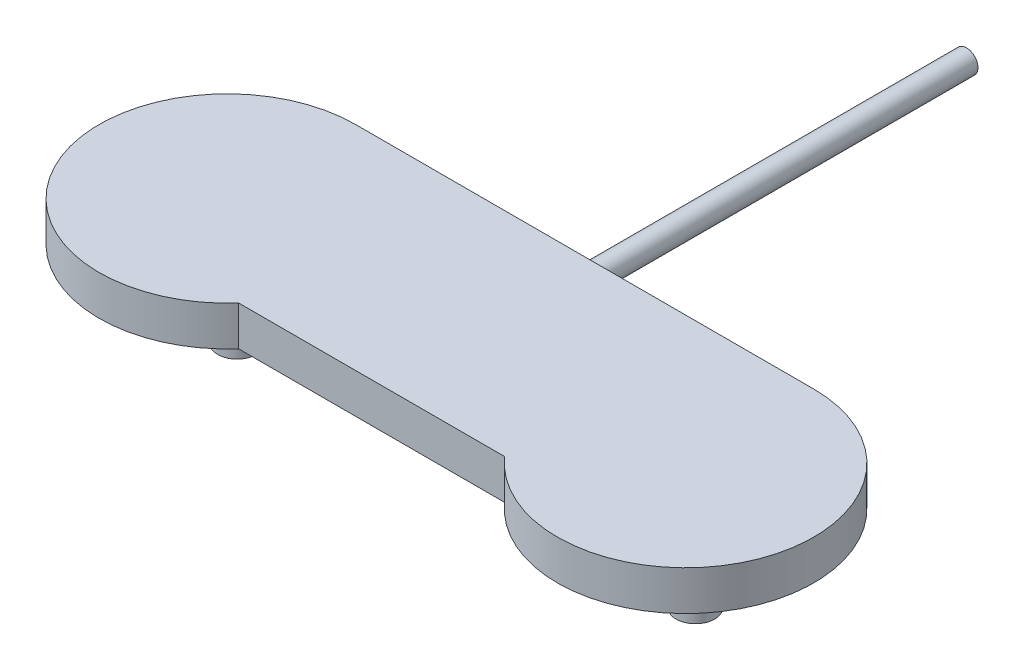
ISO-10303-21;
HEADER;
FILE_DESCRIPTION(('STEP AP214'),'2;1');
FILE_NAME('part.step','',(''),(''),'','','');
FILE_SCHEMA(('AUTOMOTIVE_DESIGN { 1 0 10303 214 1 1 1 1 }'));
ENDSEC;
DATA;
#1=APPLICATION_CONTEXT('core data for automotive mechanical design processes');
#2=APPLICATION_PROTOCOL_DEFINITION('international standard','automotive_design',2000,#1);
#3=PRODUCT_CONTEXT('',#1,'mechanical');
#4=PRODUCT('Part','Part','',(#3));
#5=PRODUCT_RELATED_PRODUCT_CATEGORY('part','',(#4));
#6=PRODUCT_DEFINITION_FORMATION('','',#4);
#7=PRODUCT_DEFINITION_CONTEXT('part definition',#1,'design');
#8=PRODUCT_DEFINITION('design','',#6,#7);
#9=PRODUCT_DEFINITION_SHAPE('','',#8);
#10=(LENGTH_UNIT() NAMED_UNIT(*) SI_UNIT(.MILLI.,.METRE.));
#11=(NAMED_UNIT(*) PLANE_ANGLE_UNIT() SI_UNIT($,.RADIAN.));
#12=(NAMED_UNIT(*) SI_UNIT($,.STERADIAN.) SOLID_ANGLE_UNIT());
#13=UNCERTAINTY_MEASURE_WITH_UNIT(LENGTH_MEASURE(1.E-05),#10,'distance_accuracy_value','');
#14=(GEOMETRIC_REPRESENTATION_CONTEXT(3) GLOBAL_UNCERTAINTY_ASSIGNED_CONTEXT((#13)) GLOBAL_UNIT_ASSIGNED_CONTEXT((#10,
#11,#12)) REPRESENTATION_CONTEXT('',''));
#15=CARTESIAN_POINT('',(0.,0.,0.));
#16=DIRECTION('',(0.,0.,1.));
#17=DIRECTION('',(1.,0.,0.));
#18=AXIS2_PLACEMENT_3D('',#15,#16,#17);
#19=CARTESIAN_POINT('',(0.,5.,0.));
#20=DIRECTION('',(0.,-1.,0.));
#21=DIRECTION('',(0.,0.,-1.));
#22=AXIS2_PLACEMENT_3D('',#19,#20,#21);
#23=CYLINDRICAL_SURFACE('',#22,16.1529972902201);
#24=CARTESIAN_POINT('',(0.,0.,0.));
#25=DIRECTION('',(0.,1.,0.));
#26=DIRECTION('',(0.,0.,1.));
#27=AXIS2_PLACEMENT_3D('',#24,#25,#26);
#28=CIRCLE('',#27,16.1529972902201);
#29=CARTESIAN_POINT('',(0.,0.,-16.1529972902201));
#30=VERTEX_POINT('',#29);
#31=CARTESIAN_POINT('',(12.1146145028149,0.,10.6843547725657));
#32=VERTEX_POINT('',#31);
#33=EDGE_CURVE('E98',#30,#32,#28,.T.);
#34=ORIENTED_EDGE('',*,*,#33,.T.);
#35=DIRECTION('',(0.,-1.,0.));
#36=VECTOR('',#35,1.);
#37=CARTESIAN_POINT('',(12.1146145028149,5.,10.6843547725657));
#38=LINE('',#37,#36);
#39=CARTESIAN_POINT('',(12.1146145028149,5.,10.6843547725657));
#40=VERTEX_POINT('',#39);
#41=EDGE_CURVE('E40',#40,#32,#38,.T.);
#42=ORIENTED_EDGE('',*,*,#41,.F.);
#43=CARTESIAN_POINT('',(0.,5.,0.));
#44=DIRECTION('',(0.,1.,0.));
#45=DIRECTION('',(0.,0.,1.));
#46=AXIS2_PLACEMENT_3D('',#43,#44,#45);
#47=CIRCLE('',#46,16.1529972902201);
#48=CARTESIAN_POINT('',(0.,5.,-16.1529972902201));
#49=VERTEX_POINT('',#48);
#50=EDGE_CURVE('E84',#49,#40,#47,.T.);
#51=ORIENTED_EDGE('',*,*,#50,.F.);
#52=DIRECTION('',(0.,-1.,0.));
#53=VECTOR('',#52,1.);
#54=CARTESIAN_POINT('',(0.,5.,-16.1529972902201));
#55=LINE('',#54,#53);
#56=EDGE_CURVE('E94',#49,#30,#55,.T.);
#57=ORIENTED_EDGE('',*,*,#56,.T.);
#58=EDGE_LOOP('',(#34,#42,#51,#57));
#59=FACE_BOUND('',#58,.T.);
#60=ADVANCED_FACE('F32',(#59),#23,.T.);
#61=CARTESIAN_POINT('',(12.1146145028149,5.,10.6843547725657));
#62=DIRECTION('',(0.,0.,-1.));
#63=DIRECTION('',(-1.,0.,0.));
#64=AXIS2_PLACEMENT_3D('',#61,#62,#63);
#65=PLANE('',#64);
#66=DIRECTION('',(1.,0.,0.));
#67=VECTOR('',#66,1.);
#68=CARTESIAN_POINT('',(12.1146145028149,0.,10.6843547725657));
#69=LINE('',#68,#67);
#70=CARTESIAN_POINT('',(45.6219597447718,0.,10.6843547725657));
#71=VERTEX_POINT('',#70);
#72=EDGE_CURVE('E89',#32,#71,#69,.T.);
#73=ORIENTED_EDGE('',*,*,#72,.T.);
#74=DIRECTION('',(0.,-1.,0.));
#75=VECTOR('',#74,1.);
#76=CARTESIAN_POINT('',(45.6219597447718,5.,10.6843547725657));
#77=LINE('',#76,#75);
#78=CARTESIAN_POINT('',(45.6219597447718,5.,10.6843547725657));
#79=VERTEX_POINT('',#78);
#80=EDGE_CURVE('E87',#79,#71,#77,.T.);
#81=ORIENTED_EDGE('',*,*,#80,.F.);
#82=DIRECTION('',(1.,0.,0.));
#83=VECTOR('',#82,1.);
#84=CARTESIAN_POINT('',(12.1146145028149,5.,10.6843547725657));
#85=LINE('',#84,#83);
#86=EDGE_CURVE('E79',#40,#79,#85,.T.);
#87=ORIENTED_EDGE('',*,*,#86,.F.);
#88=ORIENTED_EDGE('',*,*,#41,.T.);
#89=EDGE_LOOP('',(#73,#81,#87,#88));
#90=FACE_BOUND('',#89,.T.);
#91=ADVANCED_FACE('F88',(#90),#65,.F.);
#92=CARTESIAN_POINT('',(57.7365742475866,5.,0.));
#93=DIRECTION('',(0.,-1.,0.));
#94=DIRECTION('',(0.,0.,-1.));
#95=AXIS2_PLACEMENT_3D('',#92,#93,#94);
#96=CYLINDRICAL_SURFACE('',#95,16.1529972902201);
#97=CARTESIAN_POINT('',(57.7365742475866,0.,0.));
#98=DIRECTION('',(0.,1.,0.));
#99=DIRECTION('',(0.,0.,1.));
#100=AXIS2_PLACEMENT_3D('',#97,#98,#99);
#101=CIRCLE('',#100,16.1529972902201);
#102=CARTESIAN_POINT('',(57.7365742475866,0.,-16.1529972902201));
#103=VERTEX_POINT('',#102);
#104=EDGE_CURVE('E65',#71,#103,#101,.T.);
#105=ORIENTED_EDGE('',*,*,#104,.T.);
#106=DIRECTION('',(0.,-1.,0.));
#107=VECTOR('',#106,1.);
#108=CARTESIAN_POINT('',(57.7365742475866,5.,-16.1529972902201));
#109=LINE('',#108,#107);
#110=CARTESIAN_POINT('',(57.7365742475866,5.,-16.1529972902201));
#111=VERTEX_POINT('',#110);
#112=EDGE_CURVE('E90',#111,#103,#109,.T.);
#113=ORIENTED_EDGE('',*,*,#112,.F.);
#114=CARTESIAN_POINT('',(57.7365742475866,5.,0.));
#115=DIRECTION('',(0.,1.,0.));
#116=DIRECTION('',(0.,0.,1.));
#117=AXIS2_PLACEMENT_3D('',#114,#115,#116);
#118=CIRCLE('',#117,16.1529972902201);
#119=EDGE_CURVE('E82',#79,#111,#118,.T.);
#120=ORIENTED_EDGE('',*,*,#119,.F.);
#121=ORIENTED_EDGE('',*,*,#80,.T.);
#122=EDGE_LOOP('',(#105,#113,#120,#121));
#123=FACE_BOUND('',#122,.T.);
#124=ADVANCED_FACE('F92',(#123),#96,.T.);
#125=CARTESIAN_POINT('',(0.,5.,-16.1529972902201));
#126=DIRECTION('',(0.,0.,1.));
#127=DIRECTION('',(1.,0.,0.));
#128=AXIS2_PLACEMENT_3D('',#125,#126,#127);
#129=PLANE('',#128);
#130=CARTESIAN_POINT('',(28.9701528378387,2.40068127331797,-16.1529972902201));
#131=DIRECTION('',(0.,0.,1.));
#132=DIRECTION('',(1.,0.,0.));
#133=AXIS2_PLACEMENT_3D('',#130,#131,#132);
#134=CIRCLE('',#133,1.44778381914986);
#135=CARTESIAN_POINT('',(30.4179366569886,2.40068127331797,-16.1529972902201));
#136=VERTEX_POINT('',#135);
#137=EDGE_CURVE('E11',#136,#136,#134,.F.);
#138=ORIENTED_EDGE('',*,*,#137,.F.);
#139=EDGE_LOOP('',(#138));
#140=FACE_BOUND('',#139,.T.);
#141=DIRECTION('',(-1.,0.,0.));
#142=VECTOR('',#141,1.);
#143=CARTESIAN_POINT('',(0.,0.,-16.1529972902201));
#144=LINE('',#143,#142);
#145=EDGE_CURVE('E71',#103,#30,#144,.T.);
#146=ORIENTED_EDGE('',*,*,#145,.T.);
#147=ORIENTED_EDGE('',*,*,#56,.F.);
#148=DIRECTION('',(-1.,0.,0.));
#149=VECTOR('',#148,1.);
#150=CARTESIAN_POINT('',(0.,5.,-16.1529972902201));
#151=LINE('',#150,#149);
#152=EDGE_CURVE('E48',#111,#49,#151,.T.);
#153=ORIENTED_EDGE('',*,*,#152,.F.);
#154=ORIENTED_EDGE('',*,*,#112,.T.);
#155=EDGE_LOOP('',(#146,#147,#153,#154));
#156=FACE_BOUND('',#155,.T.);
#157=ADVANCED_FACE('F121',(#140,#156),#129,.F.);
#158=CARTESIAN_POINT('',(0.,5.,0.));
#159=DIRECTION('',(0.,1.,0.));
#160=DIRECTION('',(0.,0.,1.));
#161=AXIS2_PLACEMENT_3D('',#158,#159,#160);
#162=PLANE('',#161);
#163=ORIENTED_EDGE('',*,*,#50,.T.);
#164=ORIENTED_EDGE('',*,*,#86,.T.);
#165=ORIENTED_EDGE('',*,*,#119,.T.);
#166=ORIENTED_EDGE('',*,*,#152,.T.);
#167=EDGE_LOOP('',(#163,#164,#165,#166));
#168=FACE_BOUND('',#167,.T.);
#169=ADVANCED_FACE('F80',(#168),#162,.T.);
#170=CARTESIAN_POINT('',(0.,0.,0.));
#171=DIRECTION('',(0.,1.,0.));
#172=DIRECTION('',(0.,0.,1.));
#173=AXIS2_PLACEMENT_3D('',#170,#171,#172);
#174=PLANE('',#173);
#175=CARTESIAN_POINT('',(49.3220100307603,0.,-7.18153284020129));
#176=DIRECTION('',(0.,1.,0.));
#177=DIRECTION('',(0.,0.,-1.));
#178=AXIS2_PLACEMENT_3D('',#175,#176,#177);
#179=CIRCLE('',#178,2.4447771370898);
#180=CARTESIAN_POINT('',(49.3220100307603,0.,-9.6263099772911));
#181=VERTEX_POINT('',#180);
#182=EDGE_CURVE('E256',#181,#181,#179,.T.);
#183=ORIENTED_EDGE('',*,*,#182,.T.);
#184=EDGE_LOOP('',(#183));
#185=FACE_BOUND('',#184,.T.);
#186=CARTESIAN_POINT('',(49.3220100307603,0.,7.18153284020129));
#187=DIRECTION('',(0.,1.,0.));
#188=DIRECTION('',(0.,0.,-1.));
#189=AXIS2_PLACEMENT_3D('',#186,#187,#188);
#190=CIRCLE('',#189,2.44477713708981);
#191=CARTESIAN_POINT('',(49.3220100307603,0.,4.73675570311149));
#192=VERTEX_POINT('',#191);
#193=EDGE_CURVE('E250',#192,#192,#190,.T.);
#194=ORIENTED_EDGE('',*,*,#193,.T.);
#195=EDGE_LOOP('',(#194));
#196=FACE_BOUND('',#195,.T.);
#197=CARTESIAN_POINT('',(66.1511384644129,0.,7.18153284020129));
#198=DIRECTION('',(0.,1.,0.));
#199=DIRECTION('',(0.,0.,-1.));
#200=AXIS2_PLACEMENT_3D('',#197,#198,#199);
#201=CIRCLE('',#200,2.44477713708981);
#202=CARTESIAN_POINT('',(66.1511384644129,0.,4.73675570311149));
#203=VERTEX_POINT('',#202);
#204=EDGE_CURVE('E244',#203,#203,#201,.T.);
#205=ORIENTED_EDGE('',*,*,#204,.T.);
#206=EDGE_LOOP('',(#205));
#207=FACE_BOUND('',#206,.T.);
#208=CARTESIAN_POINT('',(66.1511384644129,0.,-7.18153284020129));
#209=DIRECTION('',(0.,1.,0.));
#210=DIRECTION('',(0.,0.,-1.));
#211=AXIS2_PLACEMENT_3D('',#208,#209,#210);
#212=CIRCLE('',#211,2.44477713708981);
#213=CARTESIAN_POINT('',(66.1511384644129,0.,-9.6263099772911));
#214=VERTEX_POINT('',#213);
#215=EDGE_CURVE('E238',#214,#214,#212,.T.);
#216=ORIENTED_EDGE('',*,*,#215,.T.);
#217=EDGE_LOOP('',(#216));
#218=FACE_BOUND('',#217,.T.);
#219=CARTESIAN_POINT('',(8.41456421682626,0.,7.18153284020129));
#220=DIRECTION('',(0.,1.,0.));
#221=DIRECTION('',(0.,0.,1.));
#222=AXIS2_PLACEMENT_3D('',#219,#220,#221);
#223=CIRCLE('',#222,2.44477713708981);
#224=CARTESIAN_POINT('',(8.41456421682626,0.,9.6263099772911));
#225=VERTEX_POINT('',#224);
#226=EDGE_CURVE('E232',#225,#225,#223,.T.);
#227=ORIENTED_EDGE('',*,*,#226,.T.);
#228=EDGE_LOOP('',(#227));
#229=FACE_BOUND('',#228,.T.);
#230=CARTESIAN_POINT('',(8.41456421682626,0.,-7.18153284020129));
#231=DIRECTION('',(0.,1.,0.));
#232=DIRECTION('',(0.,0.,1.));
#233=AXIS2_PLACEMENT_3D('',#230,#231,#232);
#234=CIRCLE('',#233,2.4447771370898);
#235=CARTESIAN_POINT('',(8.41456421682626,0.,-4.73675570311149));
#236=VERTEX_POINT('',#235);
#237=EDGE_CURVE('E226',#236,#236,#234,.T.);
#238=ORIENTED_EDGE('',*,*,#237,.T.);
#239=EDGE_LOOP('',(#238));
#240=FACE_BOUND('',#239,.T.);
#241=CARTESIAN_POINT('',(-8.41456421682626,0.,7.18153284020129));
#242=DIRECTION('',(0.,1.,0.));
#243=DIRECTION('',(0.,0.,1.));
#244=AXIS2_PLACEMENT_3D('',#241,#242,#243);
#245=CIRCLE('',#244,2.44477713708981);
#246=CARTESIAN_POINT('',(-8.41456421682626,0.,9.6263099772911));
#247=VERTEX_POINT('',#246);
#248=EDGE_CURVE('E220',#247,#247,#245,.T.);
#249=ORIENTED_EDGE('',*,*,#248,.T.);
#250=EDGE_LOOP('',(#249));
#251=FACE_BOUND('',#250,.T.);
#252=CARTESIAN_POINT('',(-8.41456421682626,0.,-7.18153284020129));
#253=DIRECTION('',(0.,1.,0.));
#254=DIRECTION('',(0.,0.,1.));
#255=AXIS2_PLACEMENT_3D('',#252,#253,#254);
#256=CIRCLE('',#255,2.44477713708981);
#257=CARTESIAN_POINT('',(-8.41456421682626,0.,-4.73675570311148));
#258=VERTEX_POINT('',#257);
#259=EDGE_CURVE('E214',#258,#258,#256,.T.);
#260=ORIENTED_EDGE('',*,*,#259,.T.);
#261=EDGE_LOOP('',(#260));
#262=FACE_BOUND('',#261,.T.);
#263=ORIENTED_EDGE('',*,*,#33,.F.);
#264=ORIENTED_EDGE('',*,*,#145,.F.);
#265=ORIENTED_EDGE('',*,*,#104,.F.);
#266=ORIENTED_EDGE('',*,*,#72,.F.);
#267=EDGE_LOOP('',(#263,#264,#265,#266));
#268=FACE_BOUND('',#267,.T.);
#269=ADVANCED_FACE('F109',(#185,#196,#207,#218,#229,#240,#251,#262,#268),#174,.F.);
#270=CARTESIAN_POINT('',(-8.41456421682626,-3.,-7.18153284020129));
#271=DIRECTION('',(0.,1.,0.));
#272=DIRECTION('',(0.,0.,1.));
#273=AXIS2_PLACEMENT_3D('',#270,#271,#272);
#274=CYLINDRICAL_SURFACE('',#273,2.44477713708981);
#275=CARTESIAN_POINT('',(-8.41456421682626,-3.,-7.18153284020129));
#276=DIRECTION('',(0.,1.,0.));
#277=DIRECTION('',(0.,0.,1.));
#278=AXIS2_PLACEMENT_3D('',#275,#276,#277);
#279=CIRCLE('',#278,2.44477713708981);
#280=CARTESIAN_POINT('',(-8.41456421682626,-3.,-4.73675570311148));
#281=VERTEX_POINT('',#280);
#282=EDGE_CURVE('E101',#281,#281,#279,.T.);
#283=ORIENTED_EDGE('',*,*,#282,.T.);
#284=EDGE_LOOP('',(#283));
#285=FACE_BOUND('',#284,.T.);
#286=ORIENTED_EDGE('',*,*,#259,.F.);
#287=EDGE_LOOP('',(#286));
#288=FACE_BOUND('',#287,.T.);
#289=ADVANCED_FACE('F111',(#285,#288),#274,.T.);
#290=CARTESIAN_POINT('',(-8.41456421682626,-3.,-7.18153284020129));
#291=DIRECTION('',(0.,1.,0.));
#292=DIRECTION('',(0.,0.,1.));
#293=AXIS2_PLACEMENT_3D('',#290,#291,#292);
#294=PLANE('',#293);
#295=ORIENTED_EDGE('',*,*,#282,.F.);
#296=EDGE_LOOP('',(#295));
#297=FACE_BOUND('',#296,.T.);
#298=ADVANCED_FACE('F118',(#297),#294,.F.);
#299=CARTESIAN_POINT('',(-8.41456421682626,-3.,7.18153284020129));
#300=DIRECTION('',(0.,1.,0.));
#301=DIRECTION('',(0.,0.,1.));
#302=AXIS2_PLACEMENT_3D('',#299,#300,#301);
#303=CYLINDRICAL_SURFACE('',#302,2.44477713708981);
#304=CARTESIAN_POINT('',(-8.41456421682626,-3.,7.18153284020129));
#305=DIRECTION('',(0.,1.,0.));
#306=DIRECTION('',(0.,0.,1.));
#307=AXIS2_PLACEMENT_3D('',#304,#305,#306);
#308=CIRCLE('',#307,2.44477713708981);
#309=CARTESIAN_POINT('',(-8.41456421682626,-3.,9.6263099772911));
#310=VERTEX_POINT('',#309);
#311=EDGE_CURVE('E217',#310,#310,#308,.T.);
#312=ORIENTED_EDGE('',*,*,#311,.T.);
#313=EDGE_LOOP('',(#312));
#314=FACE_BOUND('',#313,.T.);
#315=ORIENTED_EDGE('',*,*,#248,.F.);
#316=EDGE_LOOP('',(#315));
#317=FACE_BOUND('',#316,.T.);
#318=ADVANCED_FACE('F203',(#314,#317),#303,.T.);
#319=CARTESIAN_POINT('',(-8.41456421682626,-3.,7.18153284020129));
#320=DIRECTION('',(0.,1.,0.));
#321=DIRECTION('',(0.,0.,1.));
#322=AXIS2_PLACEMENT_3D('',#319,#320,#321);
#323=PLANE('',#322);
#324=ORIENTED_EDGE('',*,*,#311,.F.);
#325=EDGE_LOOP('',(#324));
#326=FACE_BOUND('',#325,.T.);
#327=ADVANCED_FACE('F199',(#326),#323,.F.);
#328=CARTESIAN_POINT('',(8.41456421682626,-3.,-7.18153284020129));
#329=DIRECTION('',(0.,1.,0.));
#330=DIRECTION('',(0.,0.,1.));
#331=AXIS2_PLACEMENT_3D('',#328,#329,#330);
#332=CYLINDRICAL_SURFACE('',#331,2.4447771370898);
#333=CARTESIAN_POINT('',(8.41456421682626,-3.,-7.18153284020129));
#334=DIRECTION('',(0.,1.,0.));
#335=DIRECTION('',(0.,0.,1.));
#336=AXIS2_PLACEMENT_3D('',#333,#334,#335);
#337=CIRCLE('',#336,2.4447771370898);
#338=CARTESIAN_POINT('',(8.41456421682626,-3.,-4.73675570311149));
#339=VERTEX_POINT('',#338);
#340=EDGE_CURVE('E223',#339,#339,#337,.T.);
#341=ORIENTED_EDGE('',*,*,#340,.T.);
#342=EDGE_LOOP('',(#341));
#343=FACE_BOUND('',#342,.T.);
#344=ORIENTED_EDGE('',*,*,#237,.F.);
#345=EDGE_LOOP('',(#344));
#346=FACE_BOUND('',#345,.T.);
#347=ADVANCED_FACE('F195',(#343,#346),#332,.T.);
#348=CARTESIAN_POINT('',(8.41456421682626,-3.,-7.18153284020129));
#349=DIRECTION('',(0.,1.,0.));
#350=DIRECTION('',(0.,0.,1.));
#351=AXIS2_PLACEMENT_3D('',#348,#349,#350);
#352=PLANE('',#351);
#353=ORIENTED_EDGE('',*,*,#340,.F.);
#354=EDGE_LOOP('',(#353));
#355=FACE_BOUND('',#354,.T.);
#356=ADVANCED_FACE('F191',(#355),#352,.F.);
#357=CARTESIAN_POINT('',(8.41456421682626,-3.,7.18153284020129));
#358=DIRECTION('',(0.,1.,0.));
#359=DIRECTION('',(0.,0.,1.));
#360=AXIS2_PLACEMENT_3D('',#357,#358,#359);
#361=CYLINDRICAL_SURFACE('',#360,2.44477713708981);
#362=CARTESIAN_POINT('',(8.41456421682626,-3.,7.18153284020129));
#363=DIRECTION('',(0.,1.,0.));
#364=DIRECTION('',(0.,0.,1.));
#365=AXIS2_PLACEMENT_3D('',#362,#363,#364);
#366=CIRCLE('',#365,2.44477713708981);
#367=CARTESIAN_POINT('',(8.41456421682626,-3.,9.6263099772911));
#368=VERTEX_POINT('',#367);
#369=EDGE_CURVE('E229',#368,#368,#366,.T.);
#370=ORIENTED_EDGE('',*,*,#369,.T.);
#371=EDGE_LOOP('',(#370));
#372=FACE_BOUND('',#371,.T.);
#373=ORIENTED_EDGE('',*,*,#226,.F.);
#374=EDGE_LOOP('',(#373));
#375=FACE_BOUND('',#374,.T.);
#376=ADVANCED_FACE('F187',(#372,#375),#361,.T.);
#377=CARTESIAN_POINT('',(8.41456421682626,-3.,7.18153284020129));
#378=DIRECTION('',(0.,1.,0.));
#379=DIRECTION('',(0.,0.,1.));
#380=AXIS2_PLACEMENT_3D('',#377,#378,#379);
#381=PLANE('',#380);
#382=ORIENTED_EDGE('',*,*,#369,.F.);
#383=EDGE_LOOP('',(#382));
#384=FACE_BOUND('',#383,.T.);
#385=ADVANCED_FACE('F183',(#384),#381,.F.);
#386=CARTESIAN_POINT('',(66.1511384644129,-3.,-7.18153284020129));
#387=DIRECTION('',(0.,1.,0.));
#388=DIRECTION('',(0.,0.,1.));
#389=AXIS2_PLACEMENT_3D('',#386,#387,#388);
#390=CYLINDRICAL_SURFACE('',#389,2.44477713708981);
#391=CARTESIAN_POINT('',(66.1511384644129,-3.,-7.18153284020129));
#392=DIRECTION('',(0.,1.,0.));
#393=DIRECTION('',(0.,0.,-1.));
#394=AXIS2_PLACEMENT_3D('',#391,#392,#393);
#395=CIRCLE('',#394,2.44477713708981);
#396=CARTESIAN_POINT('',(66.1511384644129,-3.,-9.6263099772911));
#397=VERTEX_POINT('',#396);
#398=EDGE_CURVE('E235',#397,#397,#395,.T.);
#399=ORIENTED_EDGE('',*,*,#398,.T.);
#400=EDGE_LOOP('',(#399));
#401=FACE_BOUND('',#400,.T.);
#402=ORIENTED_EDGE('',*,*,#215,.F.);
#403=EDGE_LOOP('',(#402));
#404=FACE_BOUND('',#403,.T.);
#405=ADVANCED_FACE('F179',(#401,#404),#390,.T.);
#406=CARTESIAN_POINT('',(66.1511384644129,-3.,-7.18153284020129));
#407=DIRECTION('',(0.,-1.,0.));
#408=DIRECTION('',(0.,0.,-1.));
#409=AXIS2_PLACEMENT_3D('',#406,#407,#408);
#410=PLANE('',#409);
#411=ORIENTED_EDGE('',*,*,#398,.F.);
#412=EDGE_LOOP('',(#411));
#413=FACE_BOUND('',#412,.T.);
#414=ADVANCED_FACE('F175',(#413),#410,.T.);
#415=CARTESIAN_POINT('',(66.1511384644129,-3.,7.18153284020129));
#416=DIRECTION('',(0.,1.,0.));
#417=DIRECTION('',(0.,0.,1.));
#418=AXIS2_PLACEMENT_3D('',#415,#416,#417);
#419=CYLINDRICAL_SURFACE('',#418,2.44477713708981);
#420=CARTESIAN_POINT('',(66.1511384644129,-3.,7.18153284020129));
#421=DIRECTION('',(0.,1.,0.));
#422=DIRECTION('',(0.,0.,-1.));
#423=AXIS2_PLACEMENT_3D('',#420,#421,#422);
#424=CIRCLE('',#423,2.44477713708981);
#425=CARTESIAN_POINT('',(66.1511384644129,-3.,4.73675570311149));
#426=VERTEX_POINT('',#425);
#427=EDGE_CURVE('E241',#426,#426,#424,.T.);
#428=ORIENTED_EDGE('',*,*,#427,.T.);
#429=EDGE_LOOP('',(#428));
#430=FACE_BOUND('',#429,.T.);
#431=ORIENTED_EDGE('',*,*,#204,.F.);
#432=EDGE_LOOP('',(#431));
#433=FACE_BOUND('',#432,.T.);
#434=ADVANCED_FACE('F171',(#430,#433),#419,.T.);
#435=CARTESIAN_POINT('',(66.1511384644129,-3.,7.18153284020129));
#436=DIRECTION('',(0.,-1.,0.));
#437=DIRECTION('',(0.,0.,-1.));
#438=AXIS2_PLACEMENT_3D('',#435,#436,#437);
#439=PLANE('',#438);
#440=ORIENTED_EDGE('',*,*,#427,.F.);
#441=EDGE_LOOP('',(#440));
#442=FACE_BOUND('',#441,.T.);
#443=ADVANCED_FACE('F167',(#442),#439,.T.);
#444=CARTESIAN_POINT('',(49.3220100307603,-3.,7.18153284020129));
#445=DIRECTION('',(0.,1.,0.));
#446=DIRECTION('',(0.,0.,1.));
#447=AXIS2_PLACEMENT_3D('',#444,#445,#446);
#448=CYLINDRICAL_SURFACE('',#447,2.44477713708981);
#449=CARTESIAN_POINT('',(49.3220100307603,-3.,7.18153284020129));
#450=DIRECTION('',(0.,1.,0.));
#451=DIRECTION('',(0.,0.,-1.));
#452=AXIS2_PLACEMENT_3D('',#449,#450,#451);
#453=CIRCLE('',#452,2.44477713708981);
#454=CARTESIAN_POINT('',(49.3220100307603,-3.,4.73675570311149));
#455=VERTEX_POINT('',#454);
#456=EDGE_CURVE('E247',#455,#455,#453,.T.);
#457=ORIENTED_EDGE('',*,*,#456,.T.);
#458=EDGE_LOOP('',(#457));
#459=FACE_BOUND('',#458,.T.);
#460=ORIENTED_EDGE('',*,*,#193,.F.);
#461=EDGE_LOOP('',(#460));
#462=FACE_BOUND('',#461,.T.);
#463=ADVANCED_FACE('F163',(#459,#462),#448,.T.);
#464=CARTESIAN_POINT('',(49.3220100307603,-3.,7.18153284020129));
#465=DIRECTION('',(0.,-1.,0.));
#466=DIRECTION('',(0.,0.,-1.));
#467=AXIS2_PLACEMENT_3D('',#464,#465,#466);
#468=PLANE('',#467);
#469=ORIENTED_EDGE('',*,*,#456,.F.);
#470=EDGE_LOOP('',(#469));
#471=FACE_BOUND('',#470,.T.);
#472=ADVANCED_FACE('F159',(#471),#468,.T.);
#473=CARTESIAN_POINT('',(49.3220100307603,-3.,-7.18153284020129));
#474=DIRECTION('',(0.,1.,0.));
#475=DIRECTION('',(0.,0.,1.));
#476=AXIS2_PLACEMENT_3D('',#473,#474,#475);
#477=CYLINDRICAL_SURFACE('',#476,2.4447771370898);
#478=CARTESIAN_POINT('',(49.3220100307603,-3.,-7.18153284020129));
#479=DIRECTION('',(0.,1.,0.));
#480=DIRECTION('',(0.,0.,-1.));
#481=AXIS2_PLACEMENT_3D('',#478,#479,#480);
#482=CIRCLE('',#481,2.4447771370898);
#483=CARTESIAN_POINT('',(49.3220100307603,-3.,-9.6263099772911));
#484=VERTEX_POINT('',#483);
#485=EDGE_CURVE('E253',#484,#484,#482,.T.);
#486=ORIENTED_EDGE('',*,*,#485,.T.);
#487=EDGE_LOOP('',(#486));
#488=FACE_BOUND('',#487,.T.);
#489=ORIENTED_EDGE('',*,*,#182,.F.);
#490=EDGE_LOOP('',(#489));
#491=FACE_BOUND('',#490,.T.);
#492=ADVANCED_FACE('F152',(#488,#491),#477,.T.);
#493=CARTESIAN_POINT('',(49.3220100307603,-3.,-7.18153284020129));
#494=DIRECTION('',(0.,-1.,0.));
#495=DIRECTION('',(0.,0.,-1.));
#496=AXIS2_PLACEMENT_3D('',#493,#494,#495);
#497=PLANE('',#496);
#498=ORIENTED_EDGE('',*,*,#485,.F.);
#499=EDGE_LOOP('',(#498));
#500=FACE_BOUND('',#499,.T.);
#501=ADVANCED_FACE('F143',(#500),#497,.T.);
#502=CARTESIAN_POINT('',(28.9701528378387,2.40068127331797,-64.1529972902201));
#503=DIRECTION('',(0.,0.,1.));
#504=DIRECTION('',(1.,0.,0.));
#505=AXIS2_PLACEMENT_3D('',#502,#503,#504);
#506=CYLINDRICAL_SURFACE('',#505,1.44778381914986);
#507=CARTESIAN_POINT('',(28.9701528378387,2.40068127331797,-64.1529972902201));
#508=DIRECTION('',(0.,0.,-1.));
#509=DIRECTION('',(-1.,0.,0.));
#510=AXIS2_PLACEMENT_3D('',#507,#508,#509);
#511=CIRCLE('',#510,1.44778381914986);
#512=CARTESIAN_POINT('',(27.5223690186888,2.40068127331797,-64.1529972902201));
#513=VERTEX_POINT('',#512);
#514=EDGE_CURVE('E258',#513,#513,#511,.T.);
#515=ORIENTED_EDGE('',*,*,#514,.F.);
#516=EDGE_LOOP('',(#515));
#517=FACE_BOUND('',#516,.T.);
#518=ORIENTED_EDGE('',*,*,#137,.T.);
#519=EDGE_LOOP('',(#518));
#520=FACE_BOUND('',#519,.T.);
#521=ADVANCED_FACE('F140',(#517,#520),#506,.T.);
#522=CARTESIAN_POINT('',(28.9701528378387,2.40068127331797,-64.1529972902201));
#523=DIRECTION('',(0.,0.,-1.));
#524=DIRECTION('',(-1.,0.,0.));
#525=AXIS2_PLACEMENT_3D('',#522,#523,#524);
#526=PLANE('',#525);
#527=ORIENTED_EDGE('',*,*,#514,.T.);
#528=EDGE_LOOP('',(#527));
#529=FACE_BOUND('',#528,.T.);
#530=ADVANCED_FACE('F142',(#529),#526,.T.);
#531=CLOSED_SHELL('',(#60,#91,#124,#157,#169,#269,#289,#298,#318,#327,#347,#356,#376,#385,#405,
#414,#434,#443,#463,#472,#492,#501,#521,#530));
#532=MANIFOLD_SOLID_BREP('B2',#531);
#533=ADVANCED_BREP_SHAPE_REPRESENTATION('',(#18,#532),#14);
#534=SHAPE_DEFINITION_REPRESENTATION(#9,#533);
ENDSEC;
END-ISO-10303-21;
